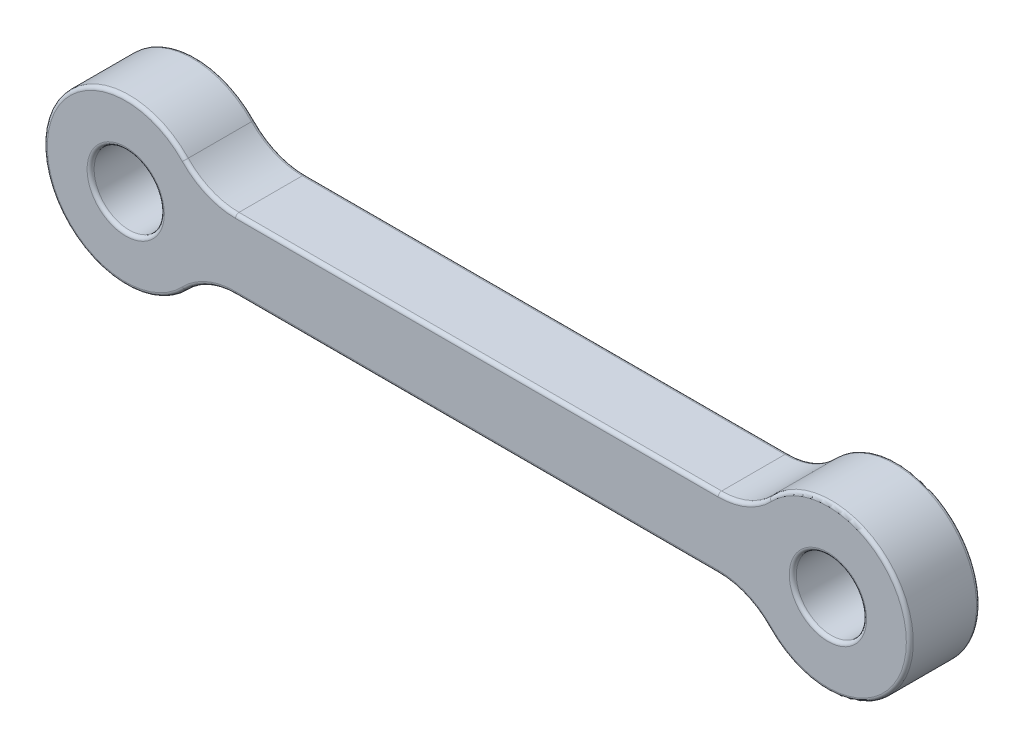
ISO-10303-21;
HEADER;
FILE_DESCRIPTION(('STEP AP214'),'2;1');
FILE_NAME('part.step','',(''),(''),'','','');
FILE_SCHEMA(('AUTOMOTIVE_DESIGN { 1 0 10303 214 1 1 1 1 }'));
ENDSEC;
DATA;
#1=APPLICATION_CONTEXT('core data for automotive mechanical design processes');
#2=APPLICATION_PROTOCOL_DEFINITION('international standard','automotive_design',2000,#1);
#3=PRODUCT_CONTEXT('',#1,'mechanical');
#4=PRODUCT('Part','Part','',(#3));
#5=PRODUCT_RELATED_PRODUCT_CATEGORY('part','',(#4));
#6=PRODUCT_DEFINITION_FORMATION('','',#4);
#7=PRODUCT_DEFINITION_CONTEXT('part definition',#1,'design');
#8=PRODUCT_DEFINITION('design','',#6,#7);
#9=PRODUCT_DEFINITION_SHAPE('','',#8);
#10=(LENGTH_UNIT() NAMED_UNIT(*) SI_UNIT(.MILLI.,.METRE.));
#11=(NAMED_UNIT(*) PLANE_ANGLE_UNIT() SI_UNIT($,.RADIAN.));
#12=(NAMED_UNIT(*) SI_UNIT($,.STERADIAN.) SOLID_ANGLE_UNIT());
#13=UNCERTAINTY_MEASURE_WITH_UNIT(LENGTH_MEASURE(1.E-05),#10,'distance_accuracy_value','');
#14=(GEOMETRIC_REPRESENTATION_CONTEXT(3) GLOBAL_UNCERTAINTY_ASSIGNED_CONTEXT((#13)) GLOBAL_UNIT_ASSIGNED_CONTEXT((#10,
#11,#12)) REPRESENTATION_CONTEXT('',''));
#15=CARTESIAN_POINT('',(0.,0.,0.));
#16=DIRECTION('',(0.,0.,1.));
#17=DIRECTION('',(1.,0.,0.));
#18=AXIS2_PLACEMENT_3D('',#15,#16,#17);
#19=CARTESIAN_POINT('',(0.,0.,-1.5));
#20=DIRECTION('',(0.,0.,1.));
#21=DIRECTION('',(1.,0.,0.));
#22=AXIS2_PLACEMENT_3D('',#19,#20,#21);
#23=PLANE('',#22);
#24=CARTESIAN_POINT('',(4.69041575982343,-4.5,-1.5));
#25=DIRECTION('',(0.,0.,-1.));
#26=DIRECTION('',(-0.72160242458822,0.692307692307693,0.));
#27=AXIS2_PLACEMENT_3D('',#24,#25,#26);
#28=CIRCLE('',#27,3.15);
#29=CARTESIAN_POINT('',(2.41736812237054,-2.31923076923077,-1.5));
#30=VERTEX_POINT('',#29);
#31=CARTESIAN_POINT('',(4.69041575982343,-1.35,-1.5));
#32=VERTEX_POINT('',#31);
#33=EDGE_CURVE('E335',#30,#32,#28,.T.);
#34=ORIENTED_EDGE('',*,*,#33,.F.);
#35=CARTESIAN_POINT('',(0.,0.,-1.5));
#36=DIRECTION('',(0.,0.,1.));
#37=DIRECTION('',(0.72160242458822,0.692307692307693,0.));
#38=AXIS2_PLACEMENT_3D('',#35,#36,#37);
#39=CIRCLE('',#38,3.35);
#40=CARTESIAN_POINT('',(2.41736812237054,2.31923076923077,-1.5));
#41=VERTEX_POINT('',#40);
#42=EDGE_CURVE('E324',#41,#30,#39,.T.);
#43=ORIENTED_EDGE('',*,*,#42,.F.);
#44=CARTESIAN_POINT('',(4.69041575982343,4.5,-1.5));
#45=DIRECTION('',(0.,0.,-1.));
#46=DIRECTION('',(0.,-1.,0.));
#47=AXIS2_PLACEMENT_3D('',#44,#45,#46);
#48=CIRCLE('',#47,3.15);
#49=CARTESIAN_POINT('',(4.69041575982343,1.35,-1.5));
#50=VERTEX_POINT('',#49);
#51=EDGE_CURVE('E312',#50,#41,#48,.T.);
#52=ORIENTED_EDGE('',*,*,#51,.F.);
#53=DIRECTION('',(-1.,0.,0.));
#54=VECTOR('',#53,1.);
#55=CARTESIAN_POINT('',(0.,1.35,-1.5));
#56=LINE('',#55,#54);
#57=CARTESIAN_POINT('',(25.3095842401766,1.35,-1.5));
#58=VERTEX_POINT('',#57);
#59=EDGE_CURVE('E438',#58,#50,#56,.T.);
#60=ORIENTED_EDGE('',*,*,#59,.F.);
#61=CARTESIAN_POINT('',(25.3095842401766,4.5,-1.5));
#62=DIRECTION('',(0.,0.,-1.));
#63=DIRECTION('',(0.72160242458822,-0.692307692307692,0.));
#64=AXIS2_PLACEMENT_3D('',#61,#62,#63);
#65=CIRCLE('',#64,3.15);
#66=CARTESIAN_POINT('',(27.5826318776295,2.31923076923077,-1.5));
#67=VERTEX_POINT('',#66);
#68=EDGE_CURVE('E299',#67,#58,#65,.T.);
#69=ORIENTED_EDGE('',*,*,#68,.F.);
#70=CARTESIAN_POINT('',(30.,0.,-1.5));
#71=DIRECTION('',(0.,0.,1.));
#72=DIRECTION('',(1.,0.,0.));
#73=AXIS2_PLACEMENT_3D('',#70,#71,#72);
#74=CIRCLE('',#73,3.35);
#75=CARTESIAN_POINT('',(33.35,0.,-1.5));
#76=VERTEX_POINT('',#75);
#77=EDGE_CURVE('E288',#76,#67,#74,.T.);
#78=ORIENTED_EDGE('',*,*,#77,.F.);
#79=CARTESIAN_POINT('',(30.,0.,-1.5));
#80=DIRECTION('',(0.,0.,1.));
#81=DIRECTION('',(-0.721602424588219,-0.692307692307693,0.));
#82=AXIS2_PLACEMENT_3D('',#79,#80,#81);
#83=CIRCLE('',#82,3.35);
#84=CARTESIAN_POINT('',(27.5826318776295,-2.31923076923077,-1.5));
#85=VERTEX_POINT('',#84);
#86=EDGE_CURVE('E248',#85,#76,#83,.T.);
#87=ORIENTED_EDGE('',*,*,#86,.F.);
#88=CARTESIAN_POINT('',(25.3095842401766,-4.5,-1.5));
#89=DIRECTION('',(0.,0.,-1.));
#90=DIRECTION('',(0.,1.,0.));
#91=AXIS2_PLACEMENT_3D('',#88,#89,#90);
#92=CIRCLE('',#91,3.15);
#93=CARTESIAN_POINT('',(25.3095842401766,-1.35,-1.5));
#94=VERTEX_POINT('',#93);
#95=EDGE_CURVE('E197',#94,#85,#92,.T.);
#96=ORIENTED_EDGE('',*,*,#95,.F.);
#97=DIRECTION('',(1.,0.,0.));
#98=VECTOR('',#97,1.);
#99=CARTESIAN_POINT('',(0.,-1.35,-1.5));
#100=LINE('',#99,#98);
#101=EDGE_CURVE('E352',#32,#94,#100,.T.);
#102=ORIENTED_EDGE('',*,*,#101,.F.);
#103=EDGE_LOOP('',(#34,#43,#52,#60,#69,#78,#87,#96,#102));
#104=FACE_BOUND('',#103,.T.);
#105=CARTESIAN_POINT('',(0.,0.,-1.5));
#106=DIRECTION('',(0.,0.,-1.));
#107=DIRECTION('',(1.,0.,0.));
#108=AXIS2_PLACEMENT_3D('',#105,#106,#107);
#109=CIRCLE('',#108,1.65);
#110=CARTESIAN_POINT('',(1.65,0.,-1.5));
#111=VERTEX_POINT('',#110);
#112=CARTESIAN_POINT('',(-1.65,0.,-1.5));
#113=VERTEX_POINT('',#112);
#114=EDGE_CURVE('E168',#111,#113,#109,.T.);
#115=ORIENTED_EDGE('',*,*,#114,.F.);
#116=CARTESIAN_POINT('',(0.,0.,-1.5));
#117=DIRECTION('',(0.,0.,-1.));
#118=DIRECTION('',(-1.,0.,0.));
#119=AXIS2_PLACEMENT_3D('',#116,#117,#118);
#120=CIRCLE('',#119,1.65);
#121=EDGE_CURVE('E244',#113,#111,#120,.T.);
#122=ORIENTED_EDGE('',*,*,#121,.F.);
#123=EDGE_LOOP('',(#115,#122));
#124=FACE_BOUND('',#123,.T.);
#125=CARTESIAN_POINT('',(30.,0.,-1.5));
#126=DIRECTION('',(0.,0.,-1.));
#127=DIRECTION('',(1.,0.,0.));
#128=AXIS2_PLACEMENT_3D('',#125,#126,#127);
#129=CIRCLE('',#128,1.65000000000001);
#130=CARTESIAN_POINT('',(31.65,0.,-1.5));
#131=VERTEX_POINT('',#130);
#132=CARTESIAN_POINT('',(28.35,0.,-1.5));
#133=VERTEX_POINT('',#132);
#134=EDGE_CURVE('E157',#131,#133,#129,.T.);
#135=ORIENTED_EDGE('',*,*,#134,.F.);
#136=CARTESIAN_POINT('',(30.,0.,-1.5));
#137=DIRECTION('',(0.,0.,-1.));
#138=DIRECTION('',(-1.,0.,0.));
#139=AXIS2_PLACEMENT_3D('',#136,#137,#138);
#140=CIRCLE('',#139,1.65000000000001);
#141=EDGE_CURVE('E161',#133,#131,#140,.T.);
#142=ORIENTED_EDGE('',*,*,#141,.F.);
#143=EDGE_LOOP('',(#135,#142));
#144=FACE_BOUND('',#143,.T.);
#145=ADVANCED_FACE('F16',(#104,#124,#144),#23,.F.);
#146=CARTESIAN_POINT('',(30.,0.,-1.35));
#147=DIRECTION('',(0.,0.,1.));
#148=DIRECTION('',(1.,0.,0.));
#149=AXIS2_PLACEMENT_3D('',#146,#147,#148);
#150=TOROIDAL_SURFACE('',#149,1.65000000000001,0.15);
#151=ORIENTED_EDGE('',*,*,#134,.T.);
#152=ORIENTED_EDGE('',*,*,#141,.T.);
#153=EDGE_LOOP('',(#151,#152));
#154=FACE_BOUND('',#153,.T.);
#155=CARTESIAN_POINT('',(30.,0.,-1.35));
#156=DIRECTION('',(0.,0.,-1.));
#157=DIRECTION('',(-1.,0.,0.));
#158=AXIS2_PLACEMENT_3D('',#155,#156,#157);
#159=CIRCLE('',#158,1.50000000000001);
#160=CARTESIAN_POINT('',(28.5,0.,-1.35));
#161=VERTEX_POINT('',#160);
#162=EDGE_CURVE('E194',#161,#161,#159,.F.);
#163=ORIENTED_EDGE('',*,*,#162,.T.);
#164=EDGE_LOOP('',(#163));
#165=FACE_BOUND('',#164,.T.);
#166=ADVANCED_FACE('F166',(#154,#165),#150,.T.);
#167=CARTESIAN_POINT('',(0.,0.,-1.35));
#168=DIRECTION('',(0.,0.,1.));
#169=DIRECTION('',(1.,0.,0.));
#170=AXIS2_PLACEMENT_3D('',#167,#168,#169);
#171=TOROIDAL_SURFACE('',#170,1.65,0.15);
#172=ORIENTED_EDGE('',*,*,#114,.T.);
#173=ORIENTED_EDGE('',*,*,#121,.T.);
#174=EDGE_LOOP('',(#172,#173));
#175=FACE_BOUND('',#174,.T.);
#176=CARTESIAN_POINT('',(0.,0.,-1.35));
#177=DIRECTION('',(0.,0.,-1.));
#178=DIRECTION('',(-1.,0.,0.));
#179=AXIS2_PLACEMENT_3D('',#176,#177,#178);
#180=CIRCLE('',#179,1.5);
#181=CARTESIAN_POINT('',(-1.5,0.,-1.35));
#182=VERTEX_POINT('',#181);
#183=EDGE_CURVE('E196',#182,#182,#180,.F.);
#184=ORIENTED_EDGE('',*,*,#183,.T.);
#185=EDGE_LOOP('',(#184));
#186=FACE_BOUND('',#185,.T.);
#187=ADVANCED_FACE('F187',(#175,#186),#171,.T.);
#188=CARTESIAN_POINT('',(30.,0.,-1.35));
#189=DIRECTION('',(0.,0.,1.));
#190=DIRECTION('',(1.,0.,0.));
#191=AXIS2_PLACEMENT_3D('',#188,#189,#190);
#192=TOROIDAL_SURFACE('',#191,3.35,0.15);
#193=CARTESIAN_POINT('',(27.5826318776295,2.31923076923077,-1.35));
#194=DIRECTION('',(0.692307692307692,0.72160242458822,0.));
#195=DIRECTION('',(0.72160242458822,-0.692307692307692,0.));
#196=AXIS2_PLACEMENT_3D('',#193,#194,#195);
#197=CIRCLE('',#196,0.15);
#198=CARTESIAN_POINT('',(27.4743915139412,2.42307692307693,-1.35));
#199=VERTEX_POINT('',#198);
#200=EDGE_CURVE('E474',#199,#67,#197,.F.);
#201=ORIENTED_EDGE('',*,*,#200,.F.);
#202=CARTESIAN_POINT('',(30.,0.,-1.35));
#203=DIRECTION('',(0.,0.,-1.));
#204=DIRECTION('',(-1.,0.,0.));
#205=AXIS2_PLACEMENT_3D('',#202,#203,#204);
#206=CIRCLE('',#205,3.5);
#207=CARTESIAN_POINT('',(27.4743915139412,-2.42307692307693,-1.35));
#208=VERTEX_POINT('',#207);
#209=EDGE_CURVE('E202',#208,#199,#206,.F.);
#210=ORIENTED_EDGE('',*,*,#209,.F.);
#211=CARTESIAN_POINT('',(27.5826318776295,-2.31923076923077,-1.35));
#212=DIRECTION('',(-0.692307692307692,0.72160242458822,0.));
#213=DIRECTION('',(0.72160242458822,0.692307692307692,0.));
#214=AXIS2_PLACEMENT_3D('',#211,#212,#213);
#215=CIRCLE('',#214,0.15);
#216=EDGE_CURVE('E376',#85,#208,#215,.T.);
#217=ORIENTED_EDGE('',*,*,#216,.F.);
#218=ORIENTED_EDGE('',*,*,#86,.T.);
#219=ORIENTED_EDGE('',*,*,#77,.T.);
#220=EDGE_LOOP('',(#201,#210,#217,#218,#219));
#221=FACE_BOUND('',#220,.T.);
#222=ADVANCED_FACE('F207',(#221),#192,.T.);
#223=CARTESIAN_POINT('',(25.3095842401766,4.5,-1.35));
#224=DIRECTION('',(0.,0.,1.));
#225=DIRECTION('',(1.,0.,0.));
#226=AXIS2_PLACEMENT_3D('',#223,#224,#225);
#227=TOROIDAL_SURFACE('',#226,3.15,0.15);
#228=ORIENTED_EDGE('',*,*,#200,.T.);
#229=ORIENTED_EDGE('',*,*,#68,.T.);
#230=CARTESIAN_POINT('',(25.3095842401766,1.35,-1.35));
#231=DIRECTION('',(-1.,0.,0.));
#232=DIRECTION('',(0.,0.,1.));
#233=AXIS2_PLACEMENT_3D('',#230,#231,#232);
#234=CIRCLE('',#233,0.15);
#235=CARTESIAN_POINT('',(25.3095842401766,1.5,-1.35));
#236=VERTEX_POINT('',#235);
#237=EDGE_CURVE('E459',#236,#58,#234,.T.);
#238=ORIENTED_EDGE('',*,*,#237,.F.);
#239=CARTESIAN_POINT('',(25.3095842401766,4.5,-1.35));
#240=DIRECTION('',(0.,0.,-1.));
#241=DIRECTION('',(-1.,0.,0.));
#242=AXIS2_PLACEMENT_3D('',#239,#240,#241);
#243=CIRCLE('',#242,3.);
#244=EDGE_CURVE('E464',#236,#199,#243,.F.);
#245=ORIENTED_EDGE('',*,*,#244,.T.);
#246=EDGE_LOOP('',(#228,#229,#238,#245));
#247=FACE_BOUND('',#246,.T.);
#248=ADVANCED_FACE('F211',(#247),#227,.T.);
#249=CARTESIAN_POINT('',(0.,1.35,-1.35));
#250=DIRECTION('',(-1.,0.,0.));
#251=DIRECTION('',(0.,0.,1.));
#252=AXIS2_PLACEMENT_3D('',#249,#250,#251);
#253=CYLINDRICAL_SURFACE('',#252,0.15);
#254=CARTESIAN_POINT('',(4.69041575982343,1.35,-1.35));
#255=DIRECTION('',(1.,0.,0.));
#256=DIRECTION('',(0.,-1.,0.));
#257=AXIS2_PLACEMENT_3D('',#254,#255,#256);
#258=CIRCLE('',#257,0.15);
#259=CARTESIAN_POINT('',(4.69041575982343,1.5,-1.35));
#260=VERTEX_POINT('',#259);
#261=EDGE_CURVE('E455',#260,#50,#258,.F.);
#262=ORIENTED_EDGE('',*,*,#261,.F.);
#263=DIRECTION('',(1.,0.,0.));
#264=VECTOR('',#263,1.);
#265=CARTESIAN_POINT('',(0.,1.5,-1.35));
#266=LINE('',#265,#264);
#267=EDGE_CURVE('E524',#236,#260,#266,.F.);
#268=ORIENTED_EDGE('',*,*,#267,.F.);
#269=ORIENTED_EDGE('',*,*,#237,.T.);
#270=ORIENTED_EDGE('',*,*,#59,.T.);
#271=EDGE_LOOP('',(#262,#268,#269,#270));
#272=FACE_BOUND('',#271,.T.);
#273=ADVANCED_FACE('F449',(#272),#253,.T.);
#274=CARTESIAN_POINT('',(4.69041575982343,4.5,-1.35));
#275=DIRECTION('',(0.,0.,1.));
#276=DIRECTION('',(1.,0.,0.));
#277=AXIS2_PLACEMENT_3D('',#274,#275,#276);
#278=TOROIDAL_SURFACE('',#277,3.15,0.15);
#279=CARTESIAN_POINT('',(2.41736812237054,2.31923076923077,-1.35));
#280=DIRECTION('',(-0.692307692307693,0.72160242458822,0.));
#281=DIRECTION('',(0.72160242458822,0.692307692307693,0.));
#282=AXIS2_PLACEMENT_3D('',#279,#280,#281);
#283=CIRCLE('',#282,0.15);
#284=CARTESIAN_POINT('',(2.52560848605877,2.42307692307692,-1.35));
#285=VERTEX_POINT('',#284);
#286=EDGE_CURVE('E925',#285,#41,#283,.T.);
#287=ORIENTED_EDGE('',*,*,#286,.F.);
#288=CARTESIAN_POINT('',(4.69041575982343,4.5,-1.35));
#289=DIRECTION('',(0.,0.,-1.));
#290=DIRECTION('',(-1.,0.,0.));
#291=AXIS2_PLACEMENT_3D('',#288,#289,#290);
#292=CIRCLE('',#291,3.);
#293=EDGE_CURVE('E535',#285,#260,#292,.F.);
#294=ORIENTED_EDGE('',*,*,#293,.T.);
#295=ORIENTED_EDGE('',*,*,#261,.T.);
#296=ORIENTED_EDGE('',*,*,#51,.T.);
#297=EDGE_LOOP('',(#287,#294,#295,#296));
#298=FACE_BOUND('',#297,.T.);
#299=ADVANCED_FACE('F440',(#298),#278,.T.);
#300=CARTESIAN_POINT('',(0.,0.,-1.35));
#301=DIRECTION('',(0.,0.,1.));
#302=DIRECTION('',(1.,0.,0.));
#303=AXIS2_PLACEMENT_3D('',#300,#301,#302);
#304=TOROIDAL_SURFACE('',#303,3.35,0.15);
#305=CARTESIAN_POINT('',(0.,0.,-1.35));
#306=DIRECTION('',(0.,0.,-1.));
#307=DIRECTION('',(-1.,0.,0.));
#308=AXIS2_PLACEMENT_3D('',#305,#306,#307);
#309=CIRCLE('',#308,3.5);
#310=CARTESIAN_POINT('',(2.52560848605877,-2.42307692307692,-1.35));
#311=VERTEX_POINT('',#310);
#312=EDGE_CURVE('E386',#285,#311,#309,.F.);
#313=ORIENTED_EDGE('',*,*,#312,.F.);
#314=ORIENTED_EDGE('',*,*,#286,.T.);
#315=ORIENTED_EDGE('',*,*,#42,.T.);
#316=CARTESIAN_POINT('',(2.41736812237054,-2.31923076923077,-1.35));
#317=DIRECTION('',(-0.692307692307693,-0.72160242458822,0.));
#318=DIRECTION('',(-0.72160242458822,0.692307692307693,0.));
#319=AXIS2_PLACEMENT_3D('',#316,#317,#318);
#320=CIRCLE('',#319,0.15);
#321=EDGE_CURVE('E401',#311,#30,#320,.F.);
#322=ORIENTED_EDGE('',*,*,#321,.F.);
#323=EDGE_LOOP('',(#313,#314,#315,#322));
#324=FACE_BOUND('',#323,.T.);
#325=ADVANCED_FACE('F407',(#324),#304,.T.);
#326=CARTESIAN_POINT('',(4.69041575982343,-4.5,-1.35));
#327=DIRECTION('',(0.,0.,1.));
#328=DIRECTION('',(1.,0.,0.));
#329=AXIS2_PLACEMENT_3D('',#326,#327,#328);
#330=TOROIDAL_SURFACE('',#329,3.15,0.15);
#331=ORIENTED_EDGE('',*,*,#321,.T.);
#332=ORIENTED_EDGE('',*,*,#33,.T.);
#333=CARTESIAN_POINT('',(4.69041575982343,-1.35,-1.35));
#334=DIRECTION('',(1.,0.,0.));
#335=DIRECTION('',(0.,0.,-1.));
#336=AXIS2_PLACEMENT_3D('',#333,#334,#335);
#337=CIRCLE('',#336,0.15);
#338=CARTESIAN_POINT('',(4.69041575982343,-1.5,-1.35));
#339=VERTEX_POINT('',#338);
#340=EDGE_CURVE('E389',#339,#32,#337,.T.);
#341=ORIENTED_EDGE('',*,*,#340,.F.);
#342=CARTESIAN_POINT('',(4.69041575982343,-4.5,-1.35));
#343=DIRECTION('',(0.,0.,-1.));
#344=DIRECTION('',(-1.,0.,0.));
#345=AXIS2_PLACEMENT_3D('',#342,#343,#344);
#346=CIRCLE('',#345,3.);
#347=EDGE_CURVE('E382',#339,#311,#346,.F.);
#348=ORIENTED_EDGE('',*,*,#347,.T.);
#349=EDGE_LOOP('',(#331,#332,#341,#348));
#350=FACE_BOUND('',#349,.T.);
#351=ADVANCED_FACE('F403',(#350),#330,.T.);
#352=CARTESIAN_POINT('',(0.,-1.35,-1.35));
#353=DIRECTION('',(1.,0.,0.));
#354=DIRECTION('',(0.,0.,-1.));
#355=AXIS2_PLACEMENT_3D('',#352,#353,#354);
#356=CYLINDRICAL_SURFACE('',#355,0.15);
#357=ORIENTED_EDGE('',*,*,#340,.T.);
#358=ORIENTED_EDGE('',*,*,#101,.T.);
#359=CARTESIAN_POINT('',(25.3095842401766,-1.35,-1.35));
#360=DIRECTION('',(-1.,0.,0.));
#361=DIRECTION('',(0.,1.,0.));
#362=AXIS2_PLACEMENT_3D('',#359,#360,#361);
#363=CIRCLE('',#362,0.15);
#364=CARTESIAN_POINT('',(25.3095842401766,-1.5,-1.35));
#365=VERTEX_POINT('',#364);
#366=EDGE_CURVE('E374',#365,#94,#363,.F.);
#367=ORIENTED_EDGE('',*,*,#366,.F.);
#368=DIRECTION('',(1.,0.,0.));
#369=VECTOR('',#368,1.);
#370=CARTESIAN_POINT('',(0.,-1.5,-1.35));
#371=LINE('',#370,#369);
#372=EDGE_CURVE('E496',#365,#339,#371,.F.);
#373=ORIENTED_EDGE('',*,*,#372,.T.);
#374=EDGE_LOOP('',(#357,#358,#367,#373));
#375=FACE_BOUND('',#374,.T.);
#376=ADVANCED_FACE('F366',(#375),#356,.T.);
#377=CARTESIAN_POINT('',(25.3095842401766,-4.5,-1.35));
#378=DIRECTION('',(0.,0.,1.));
#379=DIRECTION('',(1.,0.,0.));
#380=AXIS2_PLACEMENT_3D('',#377,#378,#379);
#381=TOROIDAL_SURFACE('',#380,3.15,0.15);
#382=ORIENTED_EDGE('',*,*,#366,.T.);
#383=ORIENTED_EDGE('',*,*,#95,.T.);
#384=ORIENTED_EDGE('',*,*,#216,.T.);
#385=CARTESIAN_POINT('',(25.3095842401766,-4.5,-1.35));
#386=DIRECTION('',(0.,0.,-1.));
#387=DIRECTION('',(-1.,0.,0.));
#388=AXIS2_PLACEMENT_3D('',#385,#386,#387);
#389=CIRCLE('',#388,3.);
#390=EDGE_CURVE('E479',#208,#365,#389,.F.);
#391=ORIENTED_EDGE('',*,*,#390,.T.);
#392=EDGE_LOOP('',(#382,#383,#384,#391));
#393=FACE_BOUND('',#392,.T.);
#394=ADVANCED_FACE('F354',(#393),#381,.T.);
#395=CARTESIAN_POINT('',(30.,0.,1.5));
#396=DIRECTION('',(0.,0.,-1.));
#397=DIRECTION('',(-1.,0.,0.));
#398=AXIS2_PLACEMENT_3D('',#395,#396,#397);
#399=CYLINDRICAL_SURFACE('',#398,1.50000000000001);
#400=CARTESIAN_POINT('',(30.,0.,1.35));
#401=DIRECTION('',(0.,0.,1.));
#402=DIRECTION('',(1.,0.,0.));
#403=AXIS2_PLACEMENT_3D('',#400,#401,#402);
#404=CIRCLE('',#403,1.50000000000001);
#405=CARTESIAN_POINT('',(31.5,0.,1.35));
#406=VERTEX_POINT('',#405);
#407=EDGE_CURVE('E489',#406,#406,#404,.F.);
#408=ORIENTED_EDGE('',*,*,#407,.F.);
#409=EDGE_LOOP('',(#408));
#410=FACE_BOUND('',#409,.T.);
#411=ORIENTED_EDGE('',*,*,#162,.F.);
#412=EDGE_LOOP('',(#411));
#413=FACE_BOUND('',#412,.T.);
#414=ADVANCED_FACE('F365',(#410,#413),#399,.F.);
#415=CARTESIAN_POINT('',(0.,0.,1.5));
#416=DIRECTION('',(0.,0.,-1.));
#417=DIRECTION('',(-1.,0.,0.));
#418=AXIS2_PLACEMENT_3D('',#415,#416,#417);
#419=CYLINDRICAL_SURFACE('',#418,1.5);
#420=CARTESIAN_POINT('',(0.,0.,1.35));
#421=DIRECTION('',(0.,0.,1.));
#422=DIRECTION('',(1.,0.,0.));
#423=AXIS2_PLACEMENT_3D('',#420,#421,#422);
#424=CIRCLE('',#423,1.5);
#425=CARTESIAN_POINT('',(1.5,0.,1.35));
#426=VERTEX_POINT('',#425);
#427=EDGE_CURVE('E501',#426,#426,#424,.F.);
#428=ORIENTED_EDGE('',*,*,#427,.F.);
#429=EDGE_LOOP('',(#428));
#430=FACE_BOUND('',#429,.T.);
#431=ORIENTED_EDGE('',*,*,#183,.F.);
#432=EDGE_LOOP('',(#431));
#433=FACE_BOUND('',#432,.T.);
#434=ADVANCED_FACE('F1007',(#430,#433),#419,.F.);
#435=CARTESIAN_POINT('',(30.,0.,1.5));
#436=DIRECTION('',(0.,0.,-1.));
#437=DIRECTION('',(-1.,0.,0.));
#438=AXIS2_PLACEMENT_3D('',#435,#436,#437);
#439=CYLINDRICAL_SURFACE('',#438,3.5);
#440=CARTESIAN_POINT('',(30.,0.,1.35));
#441=DIRECTION('',(0.,0.,1.));
#442=DIRECTION('',(1.,0.,0.));
#443=AXIS2_PLACEMENT_3D('',#440,#441,#442);
#444=CIRCLE('',#443,3.5);
#445=CARTESIAN_POINT('',(27.4743915139412,-2.42307692307692,1.35));
#446=VERTEX_POINT('',#445);
#447=CARTESIAN_POINT('',(27.4743915139412,2.42307692307693,1.35));
#448=VERTEX_POINT('',#447);
#449=EDGE_CURVE('E504',#446,#448,#444,.T.);
#450=ORIENTED_EDGE('',*,*,#449,.F.);
#451=DIRECTION('',(0.,0.,-1.));
#452=VECTOR('',#451,1.);
#453=CARTESIAN_POINT('',(27.4743915139412,-2.42307692307693,1.5));
#454=LINE('',#453,#452);
#455=EDGE_CURVE('E486',#446,#208,#454,.T.);
#456=ORIENTED_EDGE('',*,*,#455,.T.);
#457=ORIENTED_EDGE('',*,*,#209,.T.);
#458=DIRECTION('',(0.,0.,-1.));
#459=VECTOR('',#458,1.);
#460=CARTESIAN_POINT('',(27.4743915139412,2.42307692307693,1.5));
#461=LINE('',#460,#459);
#462=EDGE_CURVE('E467',#199,#448,#461,.F.);
#463=ORIENTED_EDGE('',*,*,#462,.T.);
#464=EDGE_LOOP('',(#450,#456,#457,#463));
#465=FACE_BOUND('',#464,.T.);
#466=ADVANCED_FACE('F1014',(#465),#439,.T.);
#467=CARTESIAN_POINT('',(25.3095842401766,4.5,1.5));
#468=DIRECTION('',(0.,0.,-1.));
#469=DIRECTION('',(-1.,0.,0.));
#470=AXIS2_PLACEMENT_3D('',#467,#468,#469);
#471=CYLINDRICAL_SURFACE('',#470,3.);
#472=ORIENTED_EDGE('',*,*,#244,.F.);
#473=DIRECTION('',(0.,0.,1.));
#474=VECTOR('',#473,1.);
#475=CARTESIAN_POINT('',(25.3095842401766,1.5,1.5));
#476=LINE('',#475,#474);
#477=CARTESIAN_POINT('',(25.3095842401766,1.5,1.35));
#478=VERTEX_POINT('',#477);
#479=EDGE_CURVE('E513',#478,#236,#476,.F.);
#480=ORIENTED_EDGE('',*,*,#479,.F.);
#481=CARTESIAN_POINT('',(25.3095842401766,4.5,1.35));
#482=DIRECTION('',(0.,0.,1.));
#483=DIRECTION('',(1.,0.,0.));
#484=AXIS2_PLACEMENT_3D('',#481,#482,#483);
#485=CIRCLE('',#484,3.);
#486=EDGE_CURVE('E516',#448,#478,#485,.F.);
#487=ORIENTED_EDGE('',*,*,#486,.F.);
#488=ORIENTED_EDGE('',*,*,#462,.F.);
#489=EDGE_LOOP('',(#472,#480,#487,#488));
#490=FACE_BOUND('',#489,.T.);
#491=ADVANCED_FACE('F1021',(#490),#471,.F.);
#492=CARTESIAN_POINT('',(0.,1.5,1.5));
#493=DIRECTION('',(0.,1.,0.));
#494=DIRECTION('',(0.,0.,1.));
#495=AXIS2_PLACEMENT_3D('',#492,#493,#494);
#496=PLANE('',#495);
#497=DIRECTION('',(0.,0.,-1.));
#498=VECTOR('',#497,1.);
#499=CARTESIAN_POINT('',(4.69041575982343,1.5,1.5));
#500=LINE('',#499,#498);
#501=CARTESIAN_POINT('',(4.69041575982343,1.5,1.35));
#502=VERTEX_POINT('',#501);
#503=EDGE_CURVE('E533',#260,#502,#500,.F.);
#504=ORIENTED_EDGE('',*,*,#503,.T.);
#505=DIRECTION('',(1.,0.,0.));
#506=VECTOR('',#505,1.);
#507=CARTESIAN_POINT('',(0.,1.5,1.35));
#508=LINE('',#507,#506);
#509=EDGE_CURVE('E527',#478,#502,#508,.F.);
#510=ORIENTED_EDGE('',*,*,#509,.F.);
#511=ORIENTED_EDGE('',*,*,#479,.T.);
#512=ORIENTED_EDGE('',*,*,#267,.T.);
#513=EDGE_LOOP('',(#504,#510,#511,#512));
#514=FACE_BOUND('',#513,.T.);
#515=ADVANCED_FACE('F943',(#514),#496,.T.);
#516=CARTESIAN_POINT('',(4.69041575982343,4.5,1.5));
#517=DIRECTION('',(0.,0.,-1.));
#518=DIRECTION('',(-1.,0.,0.));
#519=AXIS2_PLACEMENT_3D('',#516,#517,#518);
#520=CYLINDRICAL_SURFACE('',#519,3.);
#521=ORIENTED_EDGE('',*,*,#293,.F.);
#522=DIRECTION('',(0.,0.,-1.));
#523=VECTOR('',#522,1.);
#524=CARTESIAN_POINT('',(2.52560848605877,2.42307692307692,1.5));
#525=LINE('',#524,#523);
#526=CARTESIAN_POINT('',(2.52560848605877,2.42307692307692,1.35));
#527=VERTEX_POINT('',#526);
#528=EDGE_CURVE('E396',#527,#285,#525,.T.);
#529=ORIENTED_EDGE('',*,*,#528,.F.);
#530=CARTESIAN_POINT('',(4.69041575982343,4.5,1.35));
#531=DIRECTION('',(0.,0.,1.));
#532=DIRECTION('',(1.,0.,0.));
#533=AXIS2_PLACEMENT_3D('',#530,#531,#532);
#534=CIRCLE('',#533,3.);
#535=EDGE_CURVE('E538',#502,#527,#534,.F.);
#536=ORIENTED_EDGE('',*,*,#535,.F.);
#537=ORIENTED_EDGE('',*,*,#503,.F.);
#538=EDGE_LOOP('',(#521,#529,#536,#537));
#539=FACE_BOUND('',#538,.T.);
#540=ADVANCED_FACE('F932',(#539),#520,.F.);
#541=CARTESIAN_POINT('',(0.,0.,1.5));
#542=DIRECTION('',(0.,0.,-1.));
#543=DIRECTION('',(-1.,0.,0.));
#544=AXIS2_PLACEMENT_3D('',#541,#542,#543);
#545=CYLINDRICAL_SURFACE('',#544,3.5);
#546=ORIENTED_EDGE('',*,*,#312,.T.);
#547=DIRECTION('',(0.,0.,-1.));
#548=VECTOR('',#547,1.);
#549=CARTESIAN_POINT('',(2.52560848605877,-2.42307692307692,1.5));
#550=LINE('',#549,#548);
#551=CARTESIAN_POINT('',(2.52560848605877,-2.42307692307692,1.35));
#552=VERTEX_POINT('',#551);
#553=EDGE_CURVE('E385',#311,#552,#550,.F.);
#554=ORIENTED_EDGE('',*,*,#553,.T.);
#555=CARTESIAN_POINT('',(0.,0.,1.35));
#556=DIRECTION('',(0.,0.,1.));
#557=DIRECTION('',(1.,0.,0.));
#558=AXIS2_PLACEMENT_3D('',#555,#556,#557);
#559=CIRCLE('',#558,3.5);
#560=EDGE_CURVE('E548',#527,#552,#559,.T.);
#561=ORIENTED_EDGE('',*,*,#560,.F.);
#562=ORIENTED_EDGE('',*,*,#528,.T.);
#563=EDGE_LOOP('',(#546,#554,#561,#562));
#564=FACE_BOUND('',#563,.T.);
#565=ADVANCED_FACE('F923',(#564),#545,.T.);
#566=CARTESIAN_POINT('',(4.69041575982343,-4.5,1.5));
#567=DIRECTION('',(0.,0.,-1.));
#568=DIRECTION('',(-1.,0.,0.));
#569=AXIS2_PLACEMENT_3D('',#566,#567,#568);
#570=CYLINDRICAL_SURFACE('',#569,3.);
#571=ORIENTED_EDGE('',*,*,#347,.F.);
#572=DIRECTION('',(0.,0.,1.));
#573=VECTOR('',#572,1.);
#574=CARTESIAN_POINT('',(4.69041575982343,-1.5,1.5));
#575=LINE('',#574,#573);
#576=CARTESIAN_POINT('',(4.69041575982343,-1.5,1.35));
#577=VERTEX_POINT('',#576);
#578=EDGE_CURVE('E491',#339,#577,#575,.T.);
#579=ORIENTED_EDGE('',*,*,#578,.T.);
#580=CARTESIAN_POINT('',(4.69041575982343,-4.5,1.35));
#581=DIRECTION('',(0.,0.,1.));
#582=DIRECTION('',(1.,0.,0.));
#583=AXIS2_PLACEMENT_3D('',#580,#581,#582);
#584=CIRCLE('',#583,3.);
#585=EDGE_CURVE('E557',#552,#577,#584,.F.);
#586=ORIENTED_EDGE('',*,*,#585,.F.);
#587=ORIENTED_EDGE('',*,*,#553,.F.);
#588=EDGE_LOOP('',(#571,#579,#586,#587));
#589=FACE_BOUND('',#588,.T.);
#590=ADVANCED_FACE('F921',(#589),#570,.F.);
#591=CARTESIAN_POINT('',(0.,-1.5,1.5));
#592=DIRECTION('',(0.,1.,0.));
#593=DIRECTION('',(0.,0.,1.));
#594=AXIS2_PLACEMENT_3D('',#591,#592,#593);
#595=PLANE('',#594);
#596=ORIENTED_EDGE('',*,*,#372,.F.);
#597=DIRECTION('',(0.,0.,-1.));
#598=VECTOR('',#597,1.);
#599=CARTESIAN_POINT('',(25.3095842401766,-1.5,1.5));
#600=LINE('',#599,#598);
#601=CARTESIAN_POINT('',(25.3095842401766,-1.5,1.35));
#602=VERTEX_POINT('',#601);
#603=EDGE_CURVE('E488',#365,#602,#600,.F.);
#604=ORIENTED_EDGE('',*,*,#603,.T.);
#605=DIRECTION('',(-1.,0.,0.));
#606=VECTOR('',#605,1.);
#607=CARTESIAN_POINT('',(0.,-1.5,1.35));
#608=LINE('',#607,#606);
#609=EDGE_CURVE('E566',#577,#602,#608,.F.);
#610=ORIENTED_EDGE('',*,*,#609,.F.);
#611=ORIENTED_EDGE('',*,*,#578,.F.);
#612=EDGE_LOOP('',(#596,#604,#610,#611));
#613=FACE_BOUND('',#612,.T.);
#614=ADVANCED_FACE('F918',(#613),#595,.F.);
#615=CARTESIAN_POINT('',(25.3095842401766,-4.5,1.5));
#616=DIRECTION('',(0.,0.,-1.));
#617=DIRECTION('',(-1.,0.,0.));
#618=AXIS2_PLACEMENT_3D('',#615,#616,#617);
#619=CYLINDRICAL_SURFACE('',#618,3.);
#620=ORIENTED_EDGE('',*,*,#390,.F.);
#621=ORIENTED_EDGE('',*,*,#455,.F.);
#622=CARTESIAN_POINT('',(25.3095842401766,-4.5,1.35));
#623=DIRECTION('',(0.,0.,1.));
#624=DIRECTION('',(1.,0.,0.));
#625=AXIS2_PLACEMENT_3D('',#622,#623,#624);
#626=CIRCLE('',#625,3.);
#627=EDGE_CURVE('E574',#602,#446,#626,.F.);
#628=ORIENTED_EDGE('',*,*,#627,.F.);
#629=ORIENTED_EDGE('',*,*,#603,.F.);
#630=EDGE_LOOP('',(#620,#621,#628,#629));
#631=FACE_BOUND('',#630,.T.);
#632=ADVANCED_FACE('F484',(#631),#619,.F.);
#633=CARTESIAN_POINT('',(30.,0.,1.35));
#634=DIRECTION('',(0.,0.,1.));
#635=DIRECTION('',(1.,0.,0.));
#636=AXIS2_PLACEMENT_3D('',#633,#634,#635);
#637=TOROIDAL_SURFACE('',#636,1.65000000000001,0.15);
#638=ORIENTED_EDGE('',*,*,#407,.T.);
#639=EDGE_LOOP('',(#638));
#640=FACE_BOUND('',#639,.T.);
#641=CARTESIAN_POINT('',(30.,0.,1.5));
#642=DIRECTION('',(0.,0.,1.));
#643=DIRECTION('',(1.,0.,0.));
#644=AXIS2_PLACEMENT_3D('',#641,#642,#643);
#645=CIRCLE('',#644,1.65000000000001);
#646=CARTESIAN_POINT('',(28.35,0.,1.5));
#647=VERTEX_POINT('',#646);
#648=CARTESIAN_POINT('',(31.65,0.,1.5));
#649=VERTEX_POINT('',#648);
#650=EDGE_CURVE('E870',#647,#649,#645,.F.);
#651=ORIENTED_EDGE('',*,*,#650,.F.);
#652=CARTESIAN_POINT('',(30.,0.,1.5));
#653=DIRECTION('',(0.,0.,1.));
#654=DIRECTION('',(-1.,0.,0.));
#655=AXIS2_PLACEMENT_3D('',#652,#653,#654);
#656=CIRCLE('',#655,1.65000000000001);
#657=EDGE_CURVE('E740',#649,#647,#656,.F.);
#658=ORIENTED_EDGE('',*,*,#657,.F.);
#659=EDGE_LOOP('',(#651,#658));
#660=FACE_BOUND('',#659,.T.);
#661=ADVANCED_FACE('F583',(#640,#660),#637,.T.);
#662=CARTESIAN_POINT('',(0.,0.,1.35));
#663=DIRECTION('',(0.,0.,1.));
#664=DIRECTION('',(1.,0.,0.));
#665=AXIS2_PLACEMENT_3D('',#662,#663,#664);
#666=TOROIDAL_SURFACE('',#665,1.65,0.15);
#667=ORIENTED_EDGE('',*,*,#427,.T.);
#668=EDGE_LOOP('',(#667));
#669=FACE_BOUND('',#668,.T.);
#670=CARTESIAN_POINT('',(0.,0.,1.5));
#671=DIRECTION('',(0.,0.,1.));
#672=DIRECTION('',(1.,0.,0.));
#673=AXIS2_PLACEMENT_3D('',#670,#671,#672);
#674=CIRCLE('',#673,1.65);
#675=CARTESIAN_POINT('',(-1.65,0.,1.5));
#676=VERTEX_POINT('',#675);
#677=CARTESIAN_POINT('',(1.65,0.,1.5));
#678=VERTEX_POINT('',#677);
#679=EDGE_CURVE('E612',#676,#678,#674,.F.);
#680=ORIENTED_EDGE('',*,*,#679,.F.);
#681=CARTESIAN_POINT('',(0.,0.,1.5));
#682=DIRECTION('',(0.,0.,1.));
#683=DIRECTION('',(-1.,0.,0.));
#684=AXIS2_PLACEMENT_3D('',#681,#682,#683);
#685=CIRCLE('',#684,1.65);
#686=EDGE_CURVE('E857',#678,#676,#685,.F.);
#687=ORIENTED_EDGE('',*,*,#686,.F.);
#688=EDGE_LOOP('',(#680,#687));
#689=FACE_BOUND('',#688,.T.);
#690=ADVANCED_FACE('F593',(#669,#689),#666,.T.);
#691=CARTESIAN_POINT('',(30.,0.,1.35));
#692=DIRECTION('',(0.,0.,1.));
#693=DIRECTION('',(1.,0.,0.));
#694=AXIS2_PLACEMENT_3D('',#691,#692,#693);
#695=TOROIDAL_SURFACE('',#694,3.35,0.15);
#696=CARTESIAN_POINT('',(27.5826318776295,2.31923076923077,1.35));
#697=DIRECTION('',(0.692307692307692,0.72160242458822,0.));
#698=DIRECTION('',(0.72160242458822,-0.692307692307692,0.));
#699=AXIS2_PLACEMENT_3D('',#696,#697,#698);
#700=CIRCLE('',#699,0.15);
#701=CARTESIAN_POINT('',(27.5826318776295,2.31923076923077,1.5));
#702=VERTEX_POINT('',#701);
#703=EDGE_CURVE('E509',#702,#448,#700,.F.);
#704=ORIENTED_EDGE('',*,*,#703,.F.);
#705=CARTESIAN_POINT('',(30.,0.,1.5));
#706=DIRECTION('',(0.,0.,-1.));
#707=DIRECTION('',(-0.72160242458822,0.692307692307692,0.));
#708=AXIS2_PLACEMENT_3D('',#705,#706,#707);
#709=CIRCLE('',#708,3.35);
#710=CARTESIAN_POINT('',(33.35,0.,1.5));
#711=VERTEX_POINT('',#710);
#712=EDGE_CURVE('E827',#711,#702,#709,.F.);
#713=ORIENTED_EDGE('',*,*,#712,.F.);
#714=CARTESIAN_POINT('',(30.,0.,1.5));
#715=DIRECTION('',(0.,0.,-1.));
#716=DIRECTION('',(1.,0.,0.));
#717=AXIS2_PLACEMENT_3D('',#714,#715,#716);
#718=CIRCLE('',#717,3.35);
#719=CARTESIAN_POINT('',(27.5826318776295,-2.31923076923077,1.5));
#720=VERTEX_POINT('',#719);
#721=EDGE_CURVE('E837',#720,#711,#718,.F.);
#722=ORIENTED_EDGE('',*,*,#721,.F.);
#723=CARTESIAN_POINT('',(27.5826318776295,-2.31923076923077,1.35));
#724=DIRECTION('',(-0.692307692307692,0.72160242458822,0.));
#725=DIRECTION('',(0.72160242458822,0.692307692307692,0.));
#726=AXIS2_PLACEMENT_3D('',#723,#724,#725);
#727=CIRCLE('',#726,0.15);
#728=EDGE_CURVE('E577',#446,#720,#727,.T.);
#729=ORIENTED_EDGE('',*,*,#728,.F.);
#730=ORIENTED_EDGE('',*,*,#449,.T.);
#731=EDGE_LOOP('',(#704,#713,#722,#729,#730));
#732=FACE_BOUND('',#731,.T.);
#733=ADVANCED_FACE('F620',(#732),#695,.T.);
#734=CARTESIAN_POINT('',(25.3095842401766,4.5,1.35));
#735=DIRECTION('',(0.,0.,1.));
#736=DIRECTION('',(1.,0.,0.));
#737=AXIS2_PLACEMENT_3D('',#734,#735,#736);
#738=TOROIDAL_SURFACE('',#737,3.15,0.15);
#739=CARTESIAN_POINT('',(25.3095842401766,1.35,1.35));
#740=DIRECTION('',(1.,0.,0.));
#741=DIRECTION('',(0.,0.,-1.));
#742=AXIS2_PLACEMENT_3D('',#739,#740,#741);
#743=CIRCLE('',#742,0.15);
#744=CARTESIAN_POINT('',(25.3095842401766,1.35,1.5));
#745=VERTEX_POINT('',#744);
#746=EDGE_CURVE('E519',#745,#478,#743,.F.);
#747=ORIENTED_EDGE('',*,*,#746,.F.);
#748=CARTESIAN_POINT('',(25.3095842401766,4.5,1.5));
#749=DIRECTION('',(0.,0.,1.));
#750=DIRECTION('',(0.,-1.,0.));
#751=AXIS2_PLACEMENT_3D('',#748,#749,#750);
#752=CIRCLE('',#751,3.15);
#753=EDGE_CURVE('E652',#702,#745,#752,.F.);
#754=ORIENTED_EDGE('',*,*,#753,.F.);
#755=ORIENTED_EDGE('',*,*,#703,.T.);
#756=ORIENTED_EDGE('',*,*,#486,.T.);
#757=EDGE_LOOP('',(#747,#754,#755,#756));
#758=FACE_BOUND('',#757,.T.);
#759=ADVANCED_FACE('F629',(#758),#738,.T.);
#760=CARTESIAN_POINT('',(0.,1.35,1.35));
#761=DIRECTION('',(1.,0.,0.));
#762=DIRECTION('',(0.,0.,-1.));
#763=AXIS2_PLACEMENT_3D('',#760,#761,#762);
#764=CYLINDRICAL_SURFACE('',#763,0.15);
#765=ORIENTED_EDGE('',*,*,#746,.T.);
#766=ORIENTED_EDGE('',*,*,#509,.T.);
#767=CARTESIAN_POINT('',(4.69041575982343,1.35,1.35));
#768=DIRECTION('',(1.,0.,0.));
#769=DIRECTION('',(0.,-1.,0.));
#770=AXIS2_PLACEMENT_3D('',#767,#768,#769);
#771=CIRCLE('',#770,0.15);
#772=CARTESIAN_POINT('',(4.69041575982343,1.35,1.5));
#773=VERTEX_POINT('',#772);
#774=EDGE_CURVE('E530',#773,#502,#771,.F.);
#775=ORIENTED_EDGE('',*,*,#774,.F.);
#776=DIRECTION('',(1.,0.,0.));
#777=VECTOR('',#776,1.);
#778=CARTESIAN_POINT('',(0.,1.35,1.5));
#779=LINE('',#778,#777);
#780=EDGE_CURVE('E761',#745,#773,#779,.F.);
#781=ORIENTED_EDGE('',*,*,#780,.F.);
#782=EDGE_LOOP('',(#765,#766,#775,#781));
#783=FACE_BOUND('',#782,.T.);
#784=ADVANCED_FACE('F680',(#783),#764,.T.);
#785=CARTESIAN_POINT('',(4.69041575982343,4.5,1.35));
#786=DIRECTION('',(0.,0.,1.));
#787=DIRECTION('',(1.,0.,0.));
#788=AXIS2_PLACEMENT_3D('',#785,#786,#787);
#789=TOROIDAL_SURFACE('',#788,3.15,0.15);
#790=ORIENTED_EDGE('',*,*,#774,.T.);
#791=ORIENTED_EDGE('',*,*,#535,.T.);
#792=CARTESIAN_POINT('',(2.41736812237054,2.31923076923077,1.35));
#793=DIRECTION('',(-0.692307692307693,0.72160242458822,0.));
#794=DIRECTION('',(0.72160242458822,0.692307692307693,0.));
#795=AXIS2_PLACEMENT_3D('',#792,#793,#794);
#796=CIRCLE('',#795,0.15);
#797=CARTESIAN_POINT('',(2.41736812237054,2.31923076923077,1.5));
#798=VERTEX_POINT('',#797);
#799=EDGE_CURVE('E541',#798,#527,#796,.T.);
#800=ORIENTED_EDGE('',*,*,#799,.F.);
#801=CARTESIAN_POINT('',(4.69041575982343,4.5,1.5));
#802=DIRECTION('',(0.,0.,1.));
#803=DIRECTION('',(-0.72160242458822,-0.692307692307692,0.));
#804=AXIS2_PLACEMENT_3D('',#801,#802,#803);
#805=CIRCLE('',#804,3.15);
#806=EDGE_CURVE('E764',#773,#798,#805,.F.);
#807=ORIENTED_EDGE('',*,*,#806,.F.);
#808=EDGE_LOOP('',(#790,#791,#800,#807));
#809=FACE_BOUND('',#808,.T.);
#810=ADVANCED_FACE('F670',(#809),#789,.T.);
#811=CARTESIAN_POINT('',(0.,0.,1.35));
#812=DIRECTION('',(0.,0.,1.));
#813=DIRECTION('',(1.,0.,0.));
#814=AXIS2_PLACEMENT_3D('',#811,#812,#813);
#815=TOROIDAL_SURFACE('',#814,3.35,0.15);
#816=ORIENTED_EDGE('',*,*,#799,.T.);
#817=ORIENTED_EDGE('',*,*,#560,.T.);
#818=CARTESIAN_POINT('',(2.41736812237054,-2.31923076923077,1.35));
#819=DIRECTION('',(-0.692307692307693,-0.72160242458822,0.));
#820=DIRECTION('',(-0.72160242458822,0.692307692307693,0.));
#821=AXIS2_PLACEMENT_3D('',#818,#819,#820);
#822=CIRCLE('',#821,0.15);
#823=CARTESIAN_POINT('',(2.41736812237054,-2.31923076923077,1.5));
#824=VERTEX_POINT('',#823);
#825=EDGE_CURVE('E551',#824,#552,#822,.F.);
#826=ORIENTED_EDGE('',*,*,#825,.F.);
#827=CARTESIAN_POINT('',(0.,0.,1.5));
#828=DIRECTION('',(0.,0.,-1.));
#829=DIRECTION('',(0.721602424588219,-0.692307692307693,0.));
#830=AXIS2_PLACEMENT_3D('',#827,#828,#829);
#831=CIRCLE('',#830,3.35);
#832=EDGE_CURVE('E702',#798,#824,#831,.F.);
#833=ORIENTED_EDGE('',*,*,#832,.F.);
#834=EDGE_LOOP('',(#816,#817,#826,#833));
#835=FACE_BOUND('',#834,.T.);
#836=ADVANCED_FACE('F679',(#835),#815,.T.);
#837=CARTESIAN_POINT('',(4.69041575982343,-4.5,1.35));
#838=DIRECTION('',(0.,0.,1.));
#839=DIRECTION('',(1.,0.,0.));
#840=AXIS2_PLACEMENT_3D('',#837,#838,#839);
#841=TOROIDAL_SURFACE('',#840,3.15,0.15);
#842=CARTESIAN_POINT('',(4.69041575982343,-1.35,1.35));
#843=DIRECTION('',(-1.,0.,0.));
#844=DIRECTION('',(0.,0.,1.));
#845=AXIS2_PLACEMENT_3D('',#842,#843,#844);
#846=CIRCLE('',#845,0.15);
#847=CARTESIAN_POINT('',(4.69041575982343,-1.35,1.5));
#848=VERTEX_POINT('',#847);
#849=EDGE_CURVE('E560',#848,#577,#846,.F.);
#850=ORIENTED_EDGE('',*,*,#849,.F.);
#851=CARTESIAN_POINT('',(4.69041575982343,-4.5,1.5));
#852=DIRECTION('',(0.,0.,1.));
#853=DIRECTION('',(0.,1.,0.));
#854=AXIS2_PLACEMENT_3D('',#851,#852,#853);
#855=CIRCLE('',#854,3.15);
#856=EDGE_CURVE('E769',#824,#848,#855,.F.);
#857=ORIENTED_EDGE('',*,*,#856,.F.);
#858=ORIENTED_EDGE('',*,*,#825,.T.);
#859=ORIENTED_EDGE('',*,*,#585,.T.);
#860=EDGE_LOOP('',(#850,#857,#858,#859));
#861=FACE_BOUND('',#860,.T.);
#862=ADVANCED_FACE('F715',(#861),#841,.T.);
#863=CARTESIAN_POINT('',(0.,-1.35,1.35));
#864=DIRECTION('',(-1.,0.,0.));
#865=DIRECTION('',(0.,0.,1.));
#866=AXIS2_PLACEMENT_3D('',#863,#864,#865);
#867=CYLINDRICAL_SURFACE('',#866,0.15);
#868=CARTESIAN_POINT('',(25.3095842401766,-1.35,1.35));
#869=DIRECTION('',(-1.,0.,0.));
#870=DIRECTION('',(0.,1.,0.));
#871=AXIS2_PLACEMENT_3D('',#868,#869,#870);
#872=CIRCLE('',#871,0.15);
#873=CARTESIAN_POINT('',(25.3095842401766,-1.35,1.5));
#874=VERTEX_POINT('',#873);
#875=EDGE_CURVE('E35',#874,#602,#872,.F.);
#876=ORIENTED_EDGE('',*,*,#875,.F.);
#877=DIRECTION('',(1.,0.,0.));
#878=VECTOR('',#877,1.);
#879=CARTESIAN_POINT('',(0.,-1.35,1.5));
#880=LINE('',#879,#878);
#881=EDGE_CURVE('E27',#848,#874,#880,.T.);
#882=ORIENTED_EDGE('',*,*,#881,.F.);
#883=ORIENTED_EDGE('',*,*,#849,.T.);
#884=ORIENTED_EDGE('',*,*,#609,.T.);
#885=EDGE_LOOP('',(#876,#882,#883,#884));
#886=FACE_BOUND('',#885,.T.);
#887=ADVANCED_FACE('F724',(#886),#867,.T.);
#888=CARTESIAN_POINT('',(25.3095842401766,-4.5,1.35));
#889=DIRECTION('',(0.,0.,1.));
#890=DIRECTION('',(1.,0.,0.));
#891=AXIS2_PLACEMENT_3D('',#888,#889,#890);
#892=TOROIDAL_SURFACE('',#891,3.15,0.15);
#893=ORIENTED_EDGE('',*,*,#728,.T.);
#894=CARTESIAN_POINT('',(25.3095842401766,-4.5,1.5));
#895=DIRECTION('',(0.,0.,1.));
#896=DIRECTION('',(0.721602424588219,0.692307692307694,0.));
#897=AXIS2_PLACEMENT_3D('',#894,#895,#896);
#898=CIRCLE('',#897,3.15);
#899=EDGE_CURVE('E11',#874,#720,#898,.F.);
#900=ORIENTED_EDGE('',*,*,#899,.F.);
#901=ORIENTED_EDGE('',*,*,#875,.T.);
#902=ORIENTED_EDGE('',*,*,#627,.T.);
#903=EDGE_LOOP('',(#893,#900,#901,#902));
#904=FACE_BOUND('',#903,.T.);
#905=ADVANCED_FACE('F745',(#904),#892,.T.);
#906=CARTESIAN_POINT('',(0.,0.,1.5));
#907=DIRECTION('',(0.,0.,1.));
#908=DIRECTION('',(1.,0.,0.));
#909=AXIS2_PLACEMENT_3D('',#906,#907,#908);
#910=PLANE('',#909);
#911=ORIENTED_EDGE('',*,*,#881,.T.);
#912=ORIENTED_EDGE('',*,*,#899,.T.);
#913=ORIENTED_EDGE('',*,*,#721,.T.);
#914=ORIENTED_EDGE('',*,*,#712,.T.);
#915=ORIENTED_EDGE('',*,*,#753,.T.);
#916=ORIENTED_EDGE('',*,*,#780,.T.);
#917=ORIENTED_EDGE('',*,*,#806,.T.);
#918=ORIENTED_EDGE('',*,*,#832,.T.);
#919=ORIENTED_EDGE('',*,*,#856,.T.);
#920=EDGE_LOOP('',(#911,#912,#913,#914,#915,#916,#917,#918,#919));
#921=FACE_BOUND('',#920,.T.);
#922=ORIENTED_EDGE('',*,*,#686,.T.);
#923=ORIENTED_EDGE('',*,*,#679,.T.);
#924=EDGE_LOOP('',(#922,#923));
#925=FACE_BOUND('',#924,.T.);
#926=ORIENTED_EDGE('',*,*,#657,.T.);
#927=ORIENTED_EDGE('',*,*,#650,.T.);
#928=EDGE_LOOP('',(#926,#927));
#929=FACE_BOUND('',#928,.T.);
#930=ADVANCED_FACE('F754',(#921,#925,#929),#910,.T.);
#931=CLOSED_SHELL('',(#145,#166,#187,#222,#248,#273,#299,#325,#351,#376,#394,#414,#434,#466,
#491,#515,#540,#565,#590,#614,#632,#661,#690,#733,#759,#784,#810,#836,#862,#887,#905,#930));
#932=MANIFOLD_SOLID_BREP('B1',#931);
#933=ADVANCED_BREP_SHAPE_REPRESENTATION('',(#18,#932),#14);
#934=SHAPE_DEFINITION_REPRESENTATION(#9,#933);
ENDSEC;
END-ISO-10303-21;
